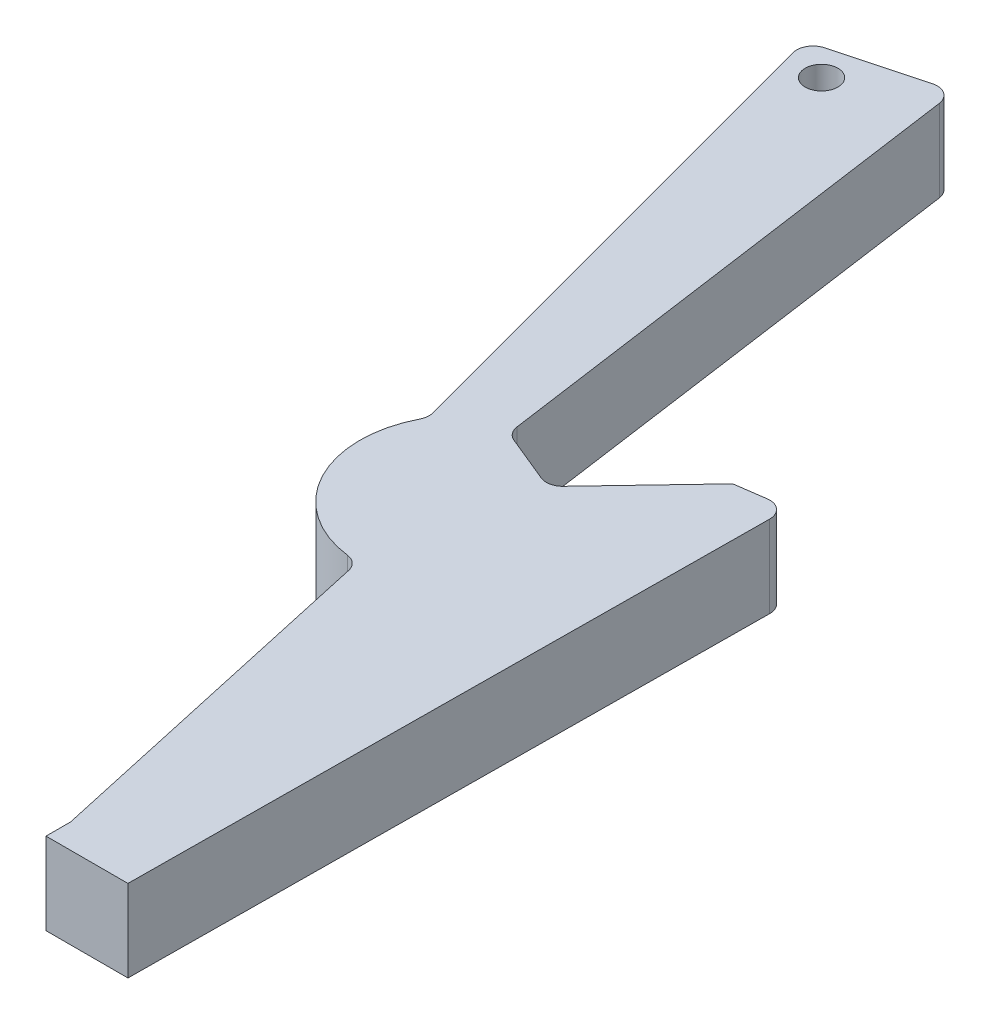
ISO-10303-21;
HEADER;
FILE_DESCRIPTION(('STEP AP214'),'2;1');
FILE_NAME('part.step','',(''),(''),'','','');
FILE_SCHEMA(('AUTOMOTIVE_DESIGN { 1 0 10303 214 1 1 1 1 }'));
ENDSEC;
DATA;
#1=APPLICATION_CONTEXT('core data for automotive mechanical design processes');
#2=APPLICATION_PROTOCOL_DEFINITION('international standard','automotive_design',2000,#1);
#3=PRODUCT_CONTEXT('',#1,'mechanical');
#4=PRODUCT('Part','Part','',(#3));
#5=PRODUCT_RELATED_PRODUCT_CATEGORY('part','',(#4));
#6=PRODUCT_DEFINITION_FORMATION('','',#4);
#7=PRODUCT_DEFINITION_CONTEXT('part definition',#1,'design');
#8=PRODUCT_DEFINITION('design','',#6,#7);
#9=PRODUCT_DEFINITION_SHAPE('','',#8);
#10=(LENGTH_UNIT() NAMED_UNIT(*) SI_UNIT(.MILLI.,.METRE.));
#11=(NAMED_UNIT(*) PLANE_ANGLE_UNIT() SI_UNIT($,.RADIAN.));
#12=(NAMED_UNIT(*) SI_UNIT($,.STERADIAN.) SOLID_ANGLE_UNIT());
#13=UNCERTAINTY_MEASURE_WITH_UNIT(LENGTH_MEASURE(1.E-05),#10,'distance_accuracy_value','');
#14=(GEOMETRIC_REPRESENTATION_CONTEXT(3) GLOBAL_UNCERTAINTY_ASSIGNED_CONTEXT((#13)) GLOBAL_UNIT_ASSIGNED_CONTEXT((#10,
#11,#12)) REPRESENTATION_CONTEXT('',''));
#15=CARTESIAN_POINT('',(0.,0.,0.));
#16=DIRECTION('',(0.,0.,1.));
#17=DIRECTION('',(1.,0.,0.));
#18=AXIS2_PLACEMENT_3D('',#15,#16,#17);
#19=CARTESIAN_POINT('',(47.1559007159547,10.,57.6384471526477));
#20=DIRECTION('',(1.,0.,0.));
#21=DIRECTION('',(0.,0.,-1.));
#22=AXIS2_PLACEMENT_3D('',#19,#20,#21);
#23=PLANE('',#22);
#24=DIRECTION('',(0.,0.,1.));
#25=VECTOR('',#24,1.);
#26=CARTESIAN_POINT('',(47.1559007159547,0.,57.6384471526477));
#27=LINE('',#26,#25);
#28=CARTESIAN_POINT('',(47.1559007159547,0.,54.6384471526477));
#29=VERTEX_POINT('',#28);
#30=CARTESIAN_POINT('',(47.1559007159547,0.,57.6384471526477));
#31=VERTEX_POINT('',#30);
#32=EDGE_CURVE('E191',#29,#31,#27,.T.);
#33=ORIENTED_EDGE('',*,*,#32,.T.);
#34=DIRECTION('',(0.,-1.,0.));
#35=VECTOR('',#34,1.);
#36=CARTESIAN_POINT('',(47.1559007159547,10.,57.6384471526477));
#37=LINE('',#36,#35);
#38=CARTESIAN_POINT('',(47.1559007159547,10.,57.6384471526477));
#39=VERTEX_POINT('',#38);
#40=EDGE_CURVE('E170',#39,#31,#37,.T.);
#41=ORIENTED_EDGE('',*,*,#40,.F.);
#42=DIRECTION('',(0.,0.,1.));
#43=VECTOR('',#42,1.);
#44=CARTESIAN_POINT('',(47.1559007159547,10.,57.6384471526477));
#45=LINE('',#44,#43);
#46=CARTESIAN_POINT('',(47.1559007159547,10.,54.6384471526477));
#47=VERTEX_POINT('',#46);
#48=EDGE_CURVE('E178',#47,#39,#45,.T.);
#49=ORIENTED_EDGE('',*,*,#48,.F.);
#50=DIRECTION('',(0.,-1.,0.));
#51=VECTOR('',#50,1.);
#52=CARTESIAN_POINT('',(47.1559007159547,10.,54.6384471526477));
#53=LINE('',#52,#51);
#54=EDGE_CURVE('E330',#47,#29,#53,.T.);
#55=ORIENTED_EDGE('',*,*,#54,.T.);
#56=EDGE_LOOP('',(#33,#41,#49,#55));
#57=FACE_BOUND('',#56,.T.);
#58=ADVANCED_FACE('F39',(#57),#23,.F.);
#59=CARTESIAN_POINT('',(57.1559007159547,10.,57.6384471526477));
#60=DIRECTION('',(0.,0.,-1.));
#61=DIRECTION('',(-1.,0.,0.));
#62=AXIS2_PLACEMENT_3D('',#59,#60,#61);
#63=PLANE('',#62);
#64=DIRECTION('',(1.,0.,0.));
#65=VECTOR('',#64,1.);
#66=CARTESIAN_POINT('',(57.1559007159547,0.,57.6384471526477));
#67=LINE('',#66,#65);
#68=CARTESIAN_POINT('',(57.1559007159547,0.,57.6384471526477));
#69=VERTEX_POINT('',#68);
#70=EDGE_CURVE('E333',#31,#69,#67,.T.);
#71=ORIENTED_EDGE('',*,*,#70,.T.);
#72=DIRECTION('',(0.,-1.,0.));
#73=VECTOR('',#72,1.);
#74=CARTESIAN_POINT('',(57.1559007159547,10.,57.6384471526477));
#75=LINE('',#74,#73);
#76=CARTESIAN_POINT('',(57.1559007159547,10.,57.6384471526477));
#77=VERTEX_POINT('',#76);
#78=EDGE_CURVE('E173',#77,#69,#75,.T.);
#79=ORIENTED_EDGE('',*,*,#78,.F.);
#80=DIRECTION('',(1.,0.,0.));
#81=VECTOR('',#80,1.);
#82=CARTESIAN_POINT('',(57.1559007159547,10.,57.6384471526477));
#83=LINE('',#82,#81);
#84=EDGE_CURVE('E166',#39,#77,#83,.T.);
#85=ORIENTED_EDGE('',*,*,#84,.F.);
#86=ORIENTED_EDGE('',*,*,#40,.T.);
#87=EDGE_LOOP('',(#71,#79,#85,#86));
#88=FACE_BOUND('',#87,.T.);
#89=ADVANCED_FACE('F168',(#88),#63,.F.);
#90=CARTESIAN_POINT('',(57.8289800939847,10.,-22.3615528473523));
#91=DIRECTION('',(-0.999964608453218,0.,-0.00841319445887169));
#92=DIRECTION('',(-0.00841319445887169,0.,0.999964608453218));
#93=AXIS2_PLACEMENT_3D('',#90,#91,#92);
#94=PLANE('',#93);
#95=DIRECTION('',(0.00841319445887169,0.,-0.999964608453218));
#96=VECTOR('',#95,1.);
#97=CARTESIAN_POINT('',(57.8289800939847,0.,-22.3615528473523));
#98=LINE('',#97,#96);
#99=CARTESIAN_POINT('',(57.8094582943466,0.,-20.0412559818916));
#100=VERTEX_POINT('',#99);
#101=EDGE_CURVE('E337',#69,#100,#98,.T.);
#102=ORIENTED_EDGE('',*,*,#101,.T.);
#103=DIRECTION('',(0.,-1.,0.));
#104=VECTOR('',#103,1.);
#105=CARTESIAN_POINT('',(57.8094582943466,10.,-20.0412559818916));
#106=LINE('',#105,#104);
#107=CARTESIAN_POINT('',(57.8094582943466,10.,-20.0412559818916));
#108=VERTEX_POINT('',#107);
#109=EDGE_CURVE('E247',#100,#108,#106,.F.);
#110=ORIENTED_EDGE('',*,*,#109,.T.);
#111=DIRECTION('',(0.00841319445887169,0.,-0.999964608453218));
#112=VECTOR('',#111,1.);
#113=CARTESIAN_POINT('',(57.8289800939847,10.,-22.3615528473523));
#114=LINE('',#113,#112);
#115=EDGE_CURVE('E177',#77,#108,#114,.T.);
#116=ORIENTED_EDGE('',*,*,#115,.F.);
#117=ORIENTED_EDGE('',*,*,#78,.T.);
#118=EDGE_LOOP('',(#102,#110,#116,#117));
#119=FACE_BOUND('',#118,.T.);
#120=ADVANCED_FACE('F416',(#119),#94,.F.);
#121=CARTESIAN_POINT('',(51.8289800939847,10.,-21.518307839138));
#122=DIRECTION('',(0.139173100960063,0.,0.990268068741571));
#123=DIRECTION('',(0.990268068741571,0.,-0.139173100960063));
#124=AXIS2_PLACEMENT_3D('',#121,#122,#123);
#125=PLANE('',#124);
#126=DIRECTION('',(-0.990268068741571,0.,0.139173100960063));
#127=VECTOR('',#126,1.);
#128=CARTESIAN_POINT('',(51.8289800939847,10.,-21.518307839138));
#129=LINE('',#128,#127);
#130=CARTESIAN_POINT('',(55.53118287552,10.,-22.0386185082925));
#131=VERTEX_POINT('',#130);
#132=CARTESIAN_POINT('',(51.8289800939847,10.,-21.518307839138));
#133=VERTEX_POINT('',#132);
#134=EDGE_CURVE('E377',#131,#133,#129,.T.);
#135=ORIENTED_EDGE('',*,*,#134,.F.);
#136=DIRECTION('',(0.,-1.,0.));
#137=VECTOR('',#136,1.);
#138=CARTESIAN_POINT('',(55.53118287552,10.,-22.0386185082925));
#139=LINE('',#138,#137);
#140=CARTESIAN_POINT('',(55.53118287552,0.,-22.0386185082925));
#141=VERTEX_POINT('',#140);
#142=EDGE_CURVE('E234',#131,#141,#139,.T.);
#143=ORIENTED_EDGE('',*,*,#142,.T.);
#144=DIRECTION('',(-0.990268068741571,0.,0.139173100960063));
#145=VECTOR('',#144,1.);
#146=CARTESIAN_POINT('',(51.8289800939847,0.,-21.518307839138));
#147=LINE('',#146,#145);
#148=CARTESIAN_POINT('',(51.8289800939847,0.,-21.518307839138));
#149=VERTEX_POINT('',#148);
#150=EDGE_CURVE('E341',#141,#149,#147,.T.);
#151=ORIENTED_EDGE('',*,*,#150,.T.);
#152=DIRECTION('',(0.,-1.,0.));
#153=VECTOR('',#152,1.);
#154=CARTESIAN_POINT('',(51.8289800939847,10.,-21.518307839138));
#155=LINE('',#154,#153);
#156=EDGE_CURVE('E199',#133,#149,#155,.T.);
#157=ORIENTED_EDGE('',*,*,#156,.F.);
#158=EDGE_LOOP('',(#135,#143,#151,#157));
#159=FACE_BOUND('',#158,.T.);
#160=ADVANCED_FACE('F465',(#159),#125,.F.);
#161=CARTESIAN_POINT('',(40.8067794307705,10.,-9.92041611090397));
#162=DIRECTION('',(0.724868233014627,0.,0.68888754145089));
#163=DIRECTION('',(0.68888754145089,0.,-0.724868233014627));
#164=AXIS2_PLACEMENT_3D('',#161,#162,#163);
#165=PLANE('',#164);
#166=DIRECTION('',(-0.68888754145089,0.,0.724868233014627));
#167=VECTOR('',#166,1.);
#168=CARTESIAN_POINT('',(40.8067794307705,0.,-9.92041611090397));
#169=LINE('',#168,#167);
#170=CARTESIAN_POINT('',(41.7504211610871,0.,-10.9133443793015));
#171=VERTEX_POINT('',#170);
#172=EDGE_CURVE('E300',#149,#171,#169,.T.);
#173=ORIENTED_EDGE('',*,*,#172,.T.);
#174=DIRECTION('',(0.,-1.,0.));
#175=VECTOR('',#174,1.);
#176=CARTESIAN_POINT('',(41.7504211610871,10.,-10.9133443793015));
#177=LINE('',#176,#175);
#178=CARTESIAN_POINT('',(41.7504211610871,10.,-10.9133443793015));
#179=VERTEX_POINT('',#178);
#180=EDGE_CURVE('E224',#171,#179,#177,.F.);
#181=ORIENTED_EDGE('',*,*,#180,.T.);
#182=DIRECTION('',(-0.68888754145089,0.,0.724868233014627));
#183=VECTOR('',#182,1.);
#184=CARTESIAN_POINT('',(40.8067794307705,10.,-9.92041611090397));
#185=LINE('',#184,#183);
#186=EDGE_CURVE('E317',#133,#179,#185,.T.);
#187=ORIENTED_EDGE('',*,*,#186,.F.);
#188=ORIENTED_EDGE('',*,*,#156,.T.);
#189=EDGE_LOOP('',(#173,#181,#187,#188));
#190=FACE_BOUND('',#189,.T.);
#191=ADVANCED_FACE('F369',(#190),#165,.F.);
#192=CARTESIAN_POINT('',(32.8067794307705,10.,-13.2107240967706));
#193=DIRECTION('',(-0.380373207890749,0.,0.924833078300566));
#194=DIRECTION('',(0.924833078300566,0.,0.380373207890749));
#195=AXIS2_PLACEMENT_3D('',#192,#193,#194);
#196=PLANE('',#195);
#197=DIRECTION('',(-0.924833078300566,0.,-0.380373207890749));
#198=VECTOR('',#197,1.);
#199=CARTESIAN_POINT('',(32.8067794307705,10.,-13.2107240967706));
#200=LINE('',#199,#198);
#201=CARTESIAN_POINT('',(39.5399382792763,10.,-10.4414533056022));
#202=VERTEX_POINT('',#201);
#203=CARTESIAN_POINT('',(33.8670194041742,10.,-12.7746595903424));
#204=VERTEX_POINT('',#203);
#205=EDGE_CURVE('E306',#202,#204,#200,.T.);
#206=ORIENTED_EDGE('',*,*,#205,.F.);
#207=DIRECTION('',(0.,-1.,0.));
#208=VECTOR('',#207,1.);
#209=CARTESIAN_POINT('',(39.5399382792763,0.,-10.4414533056022));
#210=LINE('',#209,#208);
#211=CARTESIAN_POINT('',(39.5399382792763,0.,-10.4414533056022));
#212=VERTEX_POINT('',#211);
#213=EDGE_CURVE('E220',#202,#212,#210,.T.);
#214=ORIENTED_EDGE('',*,*,#213,.T.);
#215=DIRECTION('',(-0.924833078300566,0.,-0.380373207890749));
#216=VECTOR('',#215,1.);
#217=CARTESIAN_POINT('',(32.8067794307705,0.,-13.2107240967706));
#218=LINE('',#217,#216);
#219=CARTESIAN_POINT('',(33.8670194041742,0.,-12.7746595903424));
#220=VERTEX_POINT('',#219);
#221=EDGE_CURVE('E288',#212,#220,#218,.T.);
#222=ORIENTED_EDGE('',*,*,#221,.T.);
#223=DIRECTION('',(0.,-1.,0.));
#224=VECTOR('',#223,1.);
#225=CARTESIAN_POINT('',(33.8670194041742,10.,-12.7746595903424));
#226=LINE('',#225,#224);
#227=EDGE_CURVE('E217',#220,#204,#226,.F.);
#228=ORIENTED_EDGE('',*,*,#227,.T.);
#229=EDGE_LOOP('',(#206,#214,#222,#228));
#230=FACE_BOUND('',#229,.T.);
#231=ADVANCED_FACE('F296',(#230),#196,.F.);
#232=CARTESIAN_POINT('',(23.8997009693265,10.,-76.5878804962312));
#233=DIRECTION('',(-0.990268068741571,0.,0.139173100960062));
#234=DIRECTION('',(0.139173100960062,0.,0.990268068741571));
#235=AXIS2_PLACEMENT_3D('',#232,#233,#234);
#236=PLANE('',#235);
#237=DIRECTION('',(-0.139173100960062,0.,-0.990268068741571));
#238=VECTOR('',#237,1.);
#239=CARTESIAN_POINT('',(23.8997009693265,10.,-76.5878804962312));
#240=LINE('',#239,#238);
#241=CARTESIAN_POINT('',(32.6472296824726,10.,-14.3459795450235));
#242=VERTEX_POINT('',#241);
#243=CARTESIAN_POINT('',(24.2143141188219,10.,-74.3492916180474));
#244=VERTEX_POINT('',#243);
#245=EDGE_CURVE('E305',#242,#244,#240,.T.);
#246=ORIENTED_EDGE('',*,*,#245,.F.);
#247=DIRECTION('',(0.,-1.,0.));
#248=VECTOR('',#247,1.);
#249=CARTESIAN_POINT('',(32.6472296824726,0.,-14.3459795450235));
#250=LINE('',#249,#248);
#251=CARTESIAN_POINT('',(32.6472296824726,0.,-14.3459795450235));
#252=VERTEX_POINT('',#251);
#253=EDGE_CURVE('E230',#242,#252,#250,.T.);
#254=ORIENTED_EDGE('',*,*,#253,.T.);
#255=DIRECTION('',(-0.139173100960062,0.,-0.990268068741571));
#256=VECTOR('',#255,1.);
#257=CARTESIAN_POINT('',(23.8997009693265,0.,-76.5878804962312));
#258=LINE('',#257,#256);
#259=CARTESIAN_POINT('',(24.2143141188219,0.,-74.3492916180474));
#260=VERTEX_POINT('',#259);
#261=EDGE_CURVE('E290',#252,#260,#258,.T.);
#262=ORIENTED_EDGE('',*,*,#261,.T.);
#263=DIRECTION('',(0.,-1.,0.));
#264=VECTOR('',#263,1.);
#265=CARTESIAN_POINT('',(24.2143141188219,10.,-74.3492916180474));
#266=LINE('',#265,#264);
#267=EDGE_CURVE('E227',#260,#244,#266,.F.);
#268=ORIENTED_EDGE('',*,*,#267,.T.);
#269=EDGE_LOOP('',(#246,#254,#262,#268));
#270=FACE_BOUND('',#269,.T.);
#271=ADVANCED_FACE('F308',(#270),#236,.F.);
#272=CARTESIAN_POINT('',(23.8997009693265,10.,-76.5878804962312));
#273=DIRECTION('',(0.258819045102515,0.,0.96592582628907));
#274=DIRECTION('',(0.96592582628907,0.,-0.258819045102515));
#275=AXIS2_PLACEMENT_3D('',#272,#273,#274);
#276=PLANE('',#275);
#277=DIRECTION('',(-0.96592582628907,0.,0.258819045102515));
#278=VECTOR('',#277,1.);
#279=CARTESIAN_POINT('',(23.8997009693265,10.,-76.5878804962312));
#280=LINE('',#279,#278);
#281=CARTESIAN_POINT('',(21.7161398911337,10.,-76.0027970687054));
#282=VERTEX_POINT('',#281);
#283=CARTESIAN_POINT('',(11.3426652275686,10.,-73.2232329098985));
#284=VERTEX_POINT('',#283);
#285=EDGE_CURVE('E311',#282,#284,#280,.T.);
#286=ORIENTED_EDGE('',*,*,#285,.F.);
#287=DIRECTION('',(0.,-1.,0.));
#288=VECTOR('',#287,1.);
#289=CARTESIAN_POINT('',(21.7161398911337,10.,-76.0027970687054));
#290=LINE('',#289,#288);
#291=CARTESIAN_POINT('',(21.7161398911337,0.,-76.0027970687054));
#292=VERTEX_POINT('',#291);
#293=EDGE_CURVE('E260',#282,#292,#290,.T.);
#294=ORIENTED_EDGE('',*,*,#293,.T.);
#295=DIRECTION('',(-0.96592582628907,0.,0.258819045102515));
#296=VECTOR('',#295,1.);
#297=CARTESIAN_POINT('',(23.8997009693265,0.,-76.5878804962312));
#298=LINE('',#297,#296);
#299=CARTESIAN_POINT('',(11.3426652275686,0.,-73.2232329098985));
#300=VERTEX_POINT('',#299);
#301=EDGE_CURVE('E349',#292,#300,#298,.T.);
#302=ORIENTED_EDGE('',*,*,#301,.T.);
#303=DIRECTION('',(0.,-1.,0.));
#304=VECTOR('',#303,1.);
#305=CARTESIAN_POINT('',(11.3426652275686,10.,-73.2232329098985));
#306=LINE('',#305,#304);
#307=EDGE_CURVE('E55',#300,#284,#306,.F.);
#308=ORIENTED_EDGE('',*,*,#307,.T.);
#309=EDGE_LOOP('',(#286,#294,#302,#308));
#310=FACE_BOUND('',#309,.T.);
#311=ADVANCED_FACE('F443',(#310),#276,.F.);
#312=CARTESIAN_POINT('',(9.41081357499043,10.,-72.7055948196934));
#313=DIRECTION('',(0.965925826289069,0.,-0.258819045102518));
#314=DIRECTION('',(-0.258819045102518,0.,-0.965925826289069));
#315=AXIS2_PLACEMENT_3D('',#312,#313,#314);
#316=PLANE('',#315);
#317=DIRECTION('',(0.258819045102518,0.,0.965925826289069));
#318=VECTOR('',#317,1.);
#319=CARTESIAN_POINT('',(9.41081357499043,0.,-72.7055948196934));
#320=LINE('',#319,#318);
#321=CARTESIAN_POINT('',(9.92845166519547,0.,-70.7737431671153));
#322=VERTEX_POINT('',#321);
#323=CARTESIAN_POINT('',(26.0269563367523,0.,-10.6933058069797));
#324=VERTEX_POINT('',#323);
#325=EDGE_CURVE('E352',#322,#324,#320,.T.);
#326=ORIENTED_EDGE('',*,*,#325,.T.);
#327=DIRECTION('',(0.,1.,0.));
#328=VECTOR('',#327,1.);
#329=CARTESIAN_POINT('',(26.0269563367523,10.,-10.6933058069797));
#330=LINE('',#329,#328);
#331=CARTESIAN_POINT('',(26.0269563367523,10.,-10.6933058069797));
#332=VERTEX_POINT('',#331);
#333=EDGE_CURVE('E210',#324,#332,#330,.T.);
#334=ORIENTED_EDGE('',*,*,#333,.T.);
#335=DIRECTION('',(0.258819045102518,0.,0.965925826289069));
#336=VECTOR('',#335,1.);
#337=CARTESIAN_POINT('',(9.41081357499043,10.,-72.7055948196934));
#338=LINE('',#337,#336);
#339=CARTESIAN_POINT('',(9.92845166519547,10.,-70.7737431671153));
#340=VERTEX_POINT('',#339);
#341=EDGE_CURVE('E315',#340,#332,#338,.T.);
#342=ORIENTED_EDGE('',*,*,#341,.F.);
#343=DIRECTION('',(0.,-1.,0.));
#344=VECTOR('',#343,1.);
#345=CARTESIAN_POINT('',(9.92845166519547,10.,-70.7737431671153));
#346=LINE('',#345,#344);
#347=EDGE_CURVE('E206',#340,#322,#346,.T.);
#348=ORIENTED_EDGE('',*,*,#347,.T.);
#349=EDGE_LOOP('',(#326,#334,#342,#348));
#350=FACE_BOUND('',#349,.T.);
#351=ADVANCED_FACE('F449',(#350),#316,.F.);
#352=CARTESIAN_POINT('',(37.4569447333948,10.,-3.35942017879291));
#353=DIRECTION('',(0.,-1.,0.));
#354=DIRECTION('',(0.,0.,-1.));
#355=AXIS2_PLACEMENT_3D('',#352,#353,#354);
#356=CYLINDRICAL_SURFACE('',#355,13.);
#357=CARTESIAN_POINT('',(37.4569447333948,10.,-3.35942017879291));
#358=DIRECTION('',(0.,1.,0.));
#359=DIRECTION('',(0.,0.,1.));
#360=AXIS2_PLACEMENT_3D('',#357,#358,#359);
#361=CIRCLE('',#360,13.);
#362=CARTESIAN_POINT('',(25.8766833574036,10.,-9.26683471171045));
#363=VERTEX_POINT('',#362);
#364=CARTESIAN_POINT('',(35.8385441360028,10.,9.53944719421163));
#365=VERTEX_POINT('',#364);
#366=EDGE_CURVE('E324',#363,#365,#361,.T.);
#367=ORIENTED_EDGE('',*,*,#366,.F.);
#368=DIRECTION('',(0.,-1.,0.));
#369=VECTOR('',#368,1.);
#370=CARTESIAN_POINT('',(25.8766833574036,10.,-9.26683471171045));
#371=LINE('',#370,#369);
#372=CARTESIAN_POINT('',(25.8766833574036,0.,-9.26683471171045));
#373=VERTEX_POINT('',#372);
#374=EDGE_CURVE('E197',#363,#373,#371,.T.);
#375=ORIENTED_EDGE('',*,*,#374,.T.);
#376=CARTESIAN_POINT('',(37.4569447333948,0.,-3.35942017879291));
#377=DIRECTION('',(0.,1.,0.));
#378=DIRECTION('',(0.,0.,1.));
#379=AXIS2_PLACEMENT_3D('',#376,#377,#378);
#380=CIRCLE('',#379,13.);
#381=CARTESIAN_POINT('',(35.8385441360028,0.,9.53944719421163));
#382=VERTEX_POINT('',#381);
#383=EDGE_CURVE('E356',#373,#382,#380,.T.);
#384=ORIENTED_EDGE('',*,*,#383,.T.);
#385=DIRECTION('',(0.,-1.,0.));
#386=VECTOR('',#385,1.);
#387=CARTESIAN_POINT('',(35.8385441360028,10.,9.53944719421164));
#388=LINE('',#387,#386);
#389=EDGE_CURVE('E193',#382,#365,#388,.F.);
#390=ORIENTED_EDGE('',*,*,#389,.T.);
#391=EDGE_LOOP('',(#367,#375,#384,#390));
#392=FACE_BOUND('',#391,.T.);
#393=ADVANCED_FACE('F408',(#392),#356,.T.);
#394=CARTESIAN_POINT('',(47.1559007159547,10.,54.6384471526477));
#395=DIRECTION('',(0.976487458924402,0.,-0.215574215905717));
#396=DIRECTION('',(-0.215574215905717,0.,-0.976487458924402));
#397=AXIS2_PLACEMENT_3D('',#394,#395,#396);
#398=PLANE('',#397);
#399=DIRECTION('',(0.215574215905717,0.,0.976487458924402));
#400=VECTOR('',#399,1.);
#401=CARTESIAN_POINT('',(47.1559007159547,10.,54.6384471526477));
#402=LINE('',#401,#400);
#403=CARTESIAN_POINT('',(37.5425343465606,10.,11.0927398967086));
#404=VERTEX_POINT('',#403);
#405=EDGE_CURVE('E183',#404,#47,#402,.T.);
#406=ORIENTED_EDGE('',*,*,#405,.F.);
#407=DIRECTION('',(0.,1.,0.));
#408=VECTOR('',#407,1.);
#409=CARTESIAN_POINT('',(37.5425343465606,0.,11.0927398967086));
#410=LINE('',#409,#408);
#411=CARTESIAN_POINT('',(37.5425343465606,0.,11.0927398967086));
#412=VERTEX_POINT('',#411);
#413=EDGE_CURVE('E213',#404,#412,#410,.F.);
#414=ORIENTED_EDGE('',*,*,#413,.T.);
#415=DIRECTION('',(0.215574215905717,0.,0.976487458924402));
#416=VECTOR('',#415,1.);
#417=CARTESIAN_POINT('',(47.1559007159547,0.,54.6384471526477));
#418=LINE('',#417,#416);
#419=EDGE_CURVE('E188',#412,#29,#418,.T.);
#420=ORIENTED_EDGE('',*,*,#419,.T.);
#421=ORIENTED_EDGE('',*,*,#54,.F.);
#422=EDGE_LOOP('',(#406,#414,#420,#421));
#423=FACE_BOUND('',#422,.T.);
#424=ADVANCED_FACE('F401',(#423),#398,.F.);
#425=CARTESIAN_POINT('',(37.4569447333948,10.,-3.35942017879291));
#426=DIRECTION('',(0.,1.,0.));
#427=DIRECTION('',(0.,0.,1.));
#428=AXIS2_PLACEMENT_3D('',#425,#426,#427);
#429=PLANE('',#428);
#430=CARTESIAN_POINT('',(14.3097930605568,10.,-69.8771676949472));
#431=DIRECTION('',(0.,1.,0.));
#432=DIRECTION('',(0.,0.,1.));
#433=AXIS2_PLACEMENT_3D('',#430,#431,#432);
#434=CIRCLE('',#433,2.00000000000001);
#435=CARTESIAN_POINT('',(14.3097930605568,10.,-67.8771676949472));
#436=VERTEX_POINT('',#435);
#437=EDGE_CURVE('E384',#436,#436,#434,.T.);
#438=ORIENTED_EDGE('',*,*,#437,.F.);
#439=EDGE_LOOP('',(#438));
#440=FACE_BOUND('',#439,.T.);
#441=ORIENTED_EDGE('',*,*,#115,.T.);
#442=CARTESIAN_POINT('',(55.8095290774402,10.,-20.0580823708093));
#443=DIRECTION('',(0.,1.,0.));
#444=DIRECTION('',(0.,0.,1.));
#445=AXIS2_PLACEMENT_3D('',#442,#443,#444);
#446=CIRCLE('',#445,2.);
#447=EDGE_CURVE('E255',#108,#131,#446,.T.);
#448=ORIENTED_EDGE('',*,*,#447,.T.);
#449=ORIENTED_EDGE('',*,*,#134,.T.);
#450=ORIENTED_EDGE('',*,*,#186,.T.);
#451=CARTESIAN_POINT('',(40.3006846950578,10.,-12.2911194622033));
#452=DIRECTION('',(0.,1.,0.));
#453=DIRECTION('',(0.,0.,1.));
#454=AXIS2_PLACEMENT_3D('',#451,#452,#453);
#455=CIRCLE('',#454,2.);
#456=EDGE_CURVE('E279',#179,#202,#455,.F.);
#457=ORIENTED_EDGE('',*,*,#456,.T.);
#458=ORIENTED_EDGE('',*,*,#205,.T.);
#459=CARTESIAN_POINT('',(34.6277658199557,10.,-14.6243257469436));
#460=DIRECTION('',(0.,1.,0.));
#461=DIRECTION('',(0.,0.,1.));
#462=AXIS2_PLACEMENT_3D('',#459,#460,#461);
#463=CIRCLE('',#462,2.);
#464=EDGE_CURVE('E11',#204,#242,#463,.F.);
#465=ORIENTED_EDGE('',*,*,#464,.T.);
#466=ORIENTED_EDGE('',*,*,#245,.T.);
#467=CARTESIAN_POINT('',(22.2337779813388,10.,-74.0709454161273));
#468=DIRECTION('',(0.,1.,0.));
#469=DIRECTION('',(0.,0.,1.));
#470=AXIS2_PLACEMENT_3D('',#467,#468,#469);
#471=CIRCLE('',#470,2.);
#472=EDGE_CURVE('E62',#244,#282,#471,.T.);
#473=ORIENTED_EDGE('',*,*,#472,.T.);
#474=ORIENTED_EDGE('',*,*,#285,.T.);
#475=CARTESIAN_POINT('',(11.8603033177736,10.,-71.2913812573203));
#476=DIRECTION('',(0.,1.,0.));
#477=DIRECTION('',(0.,0.,1.));
#478=AXIS2_PLACEMENT_3D('',#475,#476,#477);
#479=CIRCLE('',#478,2.);
#480=EDGE_CURVE('E250',#284,#340,#479,.T.);
#481=ORIENTED_EDGE('',*,*,#480,.T.);
#482=ORIENTED_EDGE('',*,*,#341,.T.);
#483=CARTESIAN_POINT('',(24.0951046841741,10.,-10.1756677167747));
#484=DIRECTION('',(0.,1.,0.));
#485=DIRECTION('',(0.,0.,1.));
#486=AXIS2_PLACEMENT_3D('',#483,#484,#485);
#487=CIRCLE('',#486,2.);
#488=EDGE_CURVE('E267',#332,#363,#487,.F.);
#489=ORIENTED_EDGE('',*,*,#488,.T.);
#490=ORIENTED_EDGE('',*,*,#366,.T.);
#491=CARTESIAN_POINT('',(35.5895594287117,10.,11.52388832852));
#492=DIRECTION('',(0.,1.,0.));
#493=DIRECTION('',(0.,0.,1.));
#494=AXIS2_PLACEMENT_3D('',#491,#492,#493);
#495=CIRCLE('',#494,2.);
#496=EDGE_CURVE('E273',#365,#404,#495,.F.);
#497=ORIENTED_EDGE('',*,*,#496,.T.);
#498=ORIENTED_EDGE('',*,*,#405,.T.);
#499=ORIENTED_EDGE('',*,*,#48,.T.);
#500=ORIENTED_EDGE('',*,*,#84,.T.);
#501=EDGE_LOOP('',(#441,#448,#449,#450,#457,#458,#465,#466,#473,#474,#481,#482,#489,#490,#497,
#498,#499,#500));
#502=FACE_BOUND('',#501,.T.);
#503=ADVANCED_FACE('F181',(#440,#502),#429,.T.);
#504=CARTESIAN_POINT('',(37.4569447333948,0.,-3.35942017879291));
#505=DIRECTION('',(0.,1.,0.));
#506=DIRECTION('',(0.,0.,1.));
#507=AXIS2_PLACEMENT_3D('',#504,#505,#506);
#508=PLANE('',#507);
#509=CARTESIAN_POINT('',(14.3097930605568,0.,-69.8771676949472));
#510=DIRECTION('',(0.,1.,0.));
#511=DIRECTION('',(0.,0.,1.));
#512=AXIS2_PLACEMENT_3D('',#509,#510,#511);
#513=CIRCLE('',#512,2.00000000000001);
#514=CARTESIAN_POINT('',(14.3097930605568,0.,-67.8771676949472));
#515=VERTEX_POINT('',#514);
#516=EDGE_CURVE('E334',#515,#515,#513,.T.);
#517=ORIENTED_EDGE('',*,*,#516,.T.);
#518=EDGE_LOOP('',(#517));
#519=FACE_BOUND('',#518,.T.);
#520=ORIENTED_EDGE('',*,*,#150,.F.);
#521=CARTESIAN_POINT('',(55.8095290774402,0.,-20.0580823708093));
#522=DIRECTION('',(0.,1.,0.));
#523=DIRECTION('',(0.,0.,1.));
#524=AXIS2_PLACEMENT_3D('',#521,#522,#523);
#525=CIRCLE('',#524,2.);
#526=EDGE_CURVE('E244',#141,#100,#525,.F.);
#527=ORIENTED_EDGE('',*,*,#526,.T.);
#528=ORIENTED_EDGE('',*,*,#101,.F.);
#529=ORIENTED_EDGE('',*,*,#70,.F.);
#530=ORIENTED_EDGE('',*,*,#32,.F.);
#531=ORIENTED_EDGE('',*,*,#419,.F.);
#532=CARTESIAN_POINT('',(35.5895594287117,0.,11.52388832852));
#533=DIRECTION('',(0.,1.,0.));
#534=DIRECTION('',(0.,0.,1.));
#535=AXIS2_PLACEMENT_3D('',#532,#533,#534);
#536=CIRCLE('',#535,2.);
#537=EDGE_CURVE('E270',#412,#382,#536,.T.);
#538=ORIENTED_EDGE('',*,*,#537,.T.);
#539=ORIENTED_EDGE('',*,*,#383,.F.);
#540=CARTESIAN_POINT('',(24.0951046841741,0.,-10.1756677167747));
#541=DIRECTION('',(0.,1.,0.));
#542=DIRECTION('',(0.,0.,1.));
#543=AXIS2_PLACEMENT_3D('',#540,#541,#542);
#544=CIRCLE('',#543,2.);
#545=EDGE_CURVE('E264',#373,#324,#544,.T.);
#546=ORIENTED_EDGE('',*,*,#545,.T.);
#547=ORIENTED_EDGE('',*,*,#325,.F.);
#548=CARTESIAN_POINT('',(11.8603033177736,0.,-71.2913812573203));
#549=DIRECTION('',(0.,1.,0.));
#550=DIRECTION('',(0.,0.,1.));
#551=AXIS2_PLACEMENT_3D('',#548,#549,#550);
#552=CIRCLE('',#551,2.);
#553=EDGE_CURVE('E238',#322,#300,#552,.F.);
#554=ORIENTED_EDGE('',*,*,#553,.T.);
#555=ORIENTED_EDGE('',*,*,#301,.F.);
#556=CARTESIAN_POINT('',(22.2337779813388,0.,-74.0709454161273));
#557=DIRECTION('',(0.,1.,0.));
#558=DIRECTION('',(0.,0.,1.));
#559=AXIS2_PLACEMENT_3D('',#556,#557,#558);
#560=CIRCLE('',#559,2.);
#561=EDGE_CURVE('E241',#292,#260,#560,.F.);
#562=ORIENTED_EDGE('',*,*,#561,.T.);
#563=ORIENTED_EDGE('',*,*,#261,.F.);
#564=CARTESIAN_POINT('',(34.6277658199557,0.,-14.6243257469436));
#565=DIRECTION('',(0.,1.,0.));
#566=DIRECTION('',(0.,0.,1.));
#567=AXIS2_PLACEMENT_3D('',#564,#565,#566);
#568=CIRCLE('',#567,2.);
#569=EDGE_CURVE('E48',#252,#220,#568,.T.);
#570=ORIENTED_EDGE('',*,*,#569,.T.);
#571=ORIENTED_EDGE('',*,*,#221,.F.);
#572=CARTESIAN_POINT('',(40.3006846950578,0.,-12.2911194622033));
#573=DIRECTION('',(0.,1.,0.));
#574=DIRECTION('',(0.,0.,1.));
#575=AXIS2_PLACEMENT_3D('',#572,#573,#574);
#576=CIRCLE('',#575,2.);
#577=EDGE_CURVE('E276',#212,#171,#576,.T.);
#578=ORIENTED_EDGE('',*,*,#577,.T.);
#579=ORIENTED_EDGE('',*,*,#172,.F.);
#580=EDGE_LOOP('',(#520,#527,#528,#529,#530,#531,#538,#539,#546,#547,#554,#555,#562,#563,#570,
#571,#578,#579));
#581=FACE_BOUND('',#580,.T.);
#582=ADVANCED_FACE('F287',(#519,#581),#508,.F.);
#583=CARTESIAN_POINT('',(14.3097930605568,0.,-69.8771676949472));
#584=DIRECTION('',(0.,1.,0.));
#585=DIRECTION('',(0.,0.,1.));
#586=AXIS2_PLACEMENT_3D('',#583,#584,#585);
#587=CYLINDRICAL_SURFACE('',#586,2.00000000000001);
#588=ORIENTED_EDGE('',*,*,#516,.F.);
#589=EDGE_LOOP('',(#588));
#590=FACE_BOUND('',#589,.T.);
#591=ORIENTED_EDGE('',*,*,#437,.T.);
#592=EDGE_LOOP('',(#591));
#593=FACE_BOUND('',#592,.T.);
#594=ADVANCED_FACE('F393',(#590,#593),#587,.F.);
#595=CARTESIAN_POINT('',(24.0951046841741,10.,-10.1756677167747));
#596=DIRECTION('',(0.,-1.,0.));
#597=DIRECTION('',(0.,0.,-1.));
#598=AXIS2_PLACEMENT_3D('',#595,#596,#597);
#599=CYLINDRICAL_SURFACE('',#598,2.);
#600=ORIENTED_EDGE('',*,*,#488,.F.);
#601=ORIENTED_EDGE('',*,*,#333,.F.);
#602=ORIENTED_EDGE('',*,*,#545,.F.);
#603=ORIENTED_EDGE('',*,*,#374,.F.);
#604=EDGE_LOOP('',(#600,#601,#602,#603));
#605=FACE_BOUND('',#604,.T.);
#606=ADVANCED_FACE('F396',(#605),#599,.F.);
#607=CARTESIAN_POINT('',(35.5895594287117,10.,11.52388832852));
#608=DIRECTION('',(0.,-1.,0.));
#609=DIRECTION('',(0.,0.,-1.));
#610=AXIS2_PLACEMENT_3D('',#607,#608,#609);
#611=CYLINDRICAL_SURFACE('',#610,2.);
#612=ORIENTED_EDGE('',*,*,#496,.F.);
#613=ORIENTED_EDGE('',*,*,#389,.F.);
#614=ORIENTED_EDGE('',*,*,#537,.F.);
#615=ORIENTED_EDGE('',*,*,#413,.F.);
#616=EDGE_LOOP('',(#612,#613,#614,#615));
#617=FACE_BOUND('',#616,.T.);
#618=ADVANCED_FACE('F422',(#617),#611,.F.);
#619=CARTESIAN_POINT('',(40.3006846950578,10.,-12.2911194622033));
#620=DIRECTION('',(0.,1.,0.));
#621=DIRECTION('',(0.,0.,1.));
#622=AXIS2_PLACEMENT_3D('',#619,#620,#621);
#623=CYLINDRICAL_SURFACE('',#622,2.);
#624=ORIENTED_EDGE('',*,*,#456,.F.);
#625=ORIENTED_EDGE('',*,*,#180,.F.);
#626=ORIENTED_EDGE('',*,*,#577,.F.);
#627=ORIENTED_EDGE('',*,*,#213,.F.);
#628=EDGE_LOOP('',(#624,#625,#626,#627));
#629=FACE_BOUND('',#628,.T.);
#630=ADVANCED_FACE('F376',(#629),#623,.F.);
#631=CARTESIAN_POINT('',(34.6277658199557,10.,-14.6243257469436));
#632=DIRECTION('',(0.,1.,0.));
#633=DIRECTION('',(0.,0.,1.));
#634=AXIS2_PLACEMENT_3D('',#631,#632,#633);
#635=CYLINDRICAL_SURFACE('',#634,2.);
#636=ORIENTED_EDGE('',*,*,#464,.F.);
#637=ORIENTED_EDGE('',*,*,#227,.F.);
#638=ORIENTED_EDGE('',*,*,#569,.F.);
#639=ORIENTED_EDGE('',*,*,#253,.F.);
#640=EDGE_LOOP('',(#636,#637,#638,#639));
#641=FACE_BOUND('',#640,.T.);
#642=ADVANCED_FACE('F303',(#641),#635,.F.);
#643=CARTESIAN_POINT('',(55.8095290774402,10.,-20.0580823708093));
#644=DIRECTION('',(0.,-1.,0.));
#645=DIRECTION('',(0.,0.,-1.));
#646=AXIS2_PLACEMENT_3D('',#643,#644,#645);
#647=CYLINDRICAL_SURFACE('',#646,2.);
#648=ORIENTED_EDGE('',*,*,#447,.F.);
#649=ORIENTED_EDGE('',*,*,#109,.F.);
#650=ORIENTED_EDGE('',*,*,#526,.F.);
#651=ORIENTED_EDGE('',*,*,#142,.F.);
#652=EDGE_LOOP('',(#648,#649,#650,#651));
#653=FACE_BOUND('',#652,.T.);
#654=ADVANCED_FACE('F431',(#653),#647,.T.);
#655=CARTESIAN_POINT('',(22.2337779813388,10.,-74.0709454161273));
#656=DIRECTION('',(0.,-1.,0.));
#657=DIRECTION('',(0.,0.,-1.));
#658=AXIS2_PLACEMENT_3D('',#655,#656,#657);
#659=CYLINDRICAL_SURFACE('',#658,2.);
#660=ORIENTED_EDGE('',*,*,#472,.F.);
#661=ORIENTED_EDGE('',*,*,#267,.F.);
#662=ORIENTED_EDGE('',*,*,#561,.F.);
#663=ORIENTED_EDGE('',*,*,#293,.F.);
#664=EDGE_LOOP('',(#660,#661,#662,#663));
#665=FACE_BOUND('',#664,.T.);
#666=ADVANCED_FACE('F433',(#665),#659,.T.);
#667=CARTESIAN_POINT('',(11.8603033177736,10.,-71.2913812573203));
#668=DIRECTION('',(0.,-1.,0.));
#669=DIRECTION('',(0.,0.,-1.));
#670=AXIS2_PLACEMENT_3D('',#667,#668,#669);
#671=CYLINDRICAL_SURFACE('',#670,2.);
#672=ORIENTED_EDGE('',*,*,#480,.F.);
#673=ORIENTED_EDGE('',*,*,#307,.F.);
#674=ORIENTED_EDGE('',*,*,#553,.F.);
#675=ORIENTED_EDGE('',*,*,#347,.F.);
#676=EDGE_LOOP('',(#672,#673,#674,#675));
#677=FACE_BOUND('',#676,.T.);
#678=ADVANCED_FACE('F41',(#677),#671,.T.);
#679=CLOSED_SHELL('',(#58,#89,#120,#160,#191,#231,#271,#311,#351,#393,#424,#503,#582,#594,#606,
#618,#630,#642,#654,#666,#678));
#680=MANIFOLD_SOLID_BREP('B2',#679);
#681=ADVANCED_BREP_SHAPE_REPRESENTATION('',(#18,#680),#14);
#682=SHAPE_DEFINITION_REPRESENTATION(#9,#681);
ENDSEC;
END-ISO-10303-21;
